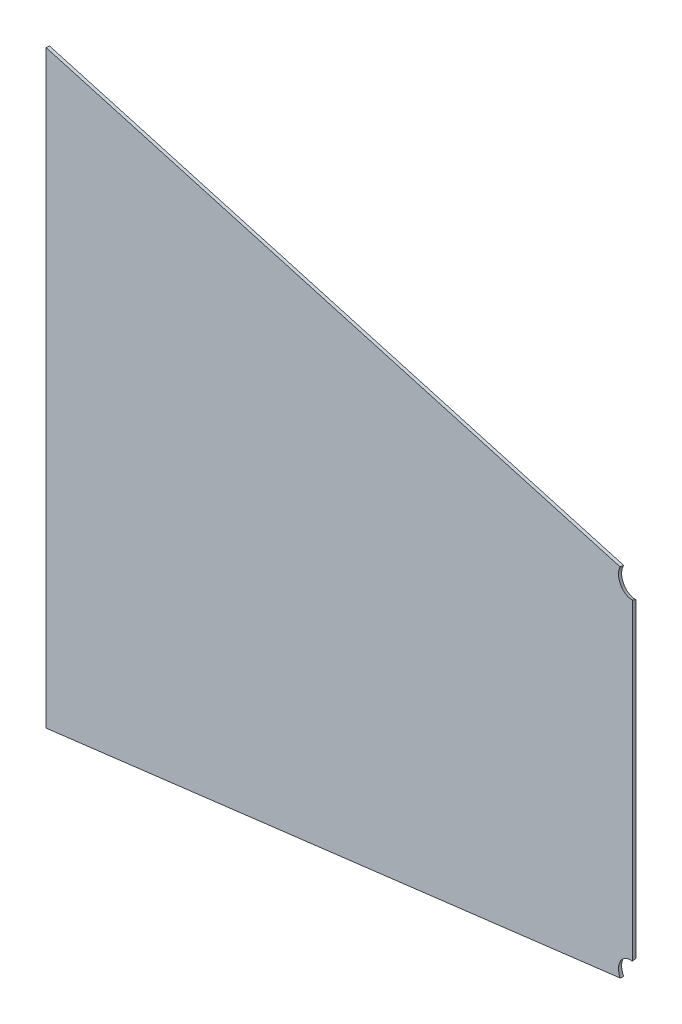
ISO-10303-21;
HEADER;
FILE_DESCRIPTION(('STEP AP214'),'2;1');
FILE_NAME('part.step','',(''),(''),'','','');
FILE_SCHEMA(('AUTOMOTIVE_DESIGN { 1 0 10303 214 1 1 1 1 }'));
ENDSEC;
DATA;
#1=APPLICATION_CONTEXT('core data for automotive mechanical design processes');
#2=APPLICATION_PROTOCOL_DEFINITION('international standard','automotive_design',2000,#1);
#3=PRODUCT_CONTEXT('',#1,'mechanical');
#4=PRODUCT('Part','Part','',(#3));
#5=PRODUCT_RELATED_PRODUCT_CATEGORY('part','',(#4));
#6=PRODUCT_DEFINITION_FORMATION('','',#4);
#7=PRODUCT_DEFINITION_CONTEXT('part definition',#1,'design');
#8=PRODUCT_DEFINITION('design','',#6,#7);
#9=PRODUCT_DEFINITION_SHAPE('','',#8);
#10=(LENGTH_UNIT() NAMED_UNIT(*) SI_UNIT(.MILLI.,.METRE.));
#11=(NAMED_UNIT(*) PLANE_ANGLE_UNIT() SI_UNIT($,.RADIAN.));
#12=(NAMED_UNIT(*) SI_UNIT($,.STERADIAN.) SOLID_ANGLE_UNIT());
#13=UNCERTAINTY_MEASURE_WITH_UNIT(LENGTH_MEASURE(1.E-05),#10,'distance_accuracy_value','');
#14=(GEOMETRIC_REPRESENTATION_CONTEXT(3) GLOBAL_UNCERTAINTY_ASSIGNED_CONTEXT((#13)) GLOBAL_UNIT_ASSIGNED_CONTEXT((#10,
#11,#12)) REPRESENTATION_CONTEXT('',''));
#15=CARTESIAN_POINT('',(0.,0.,0.));
#16=DIRECTION('',(0.,0.,1.));
#17=DIRECTION('',(1.,0.,0.));
#18=AXIS2_PLACEMENT_3D('',#15,#16,#17);
#19=CARTESIAN_POINT('',(185.325599863576,-298.45,-15.8314114961604));
#20=DIRECTION('',(-0.183879380206342,0.982853972184214,-0.0136544094212631));
#21=DIRECTION('',(-0.982945608068834,-0.183896524105788,0.));
#22=AXIS2_PLACEMENT_3D('',#19,#20,#21);
#23=PLANE('',#22);
#24=CARTESIAN_POINT('',(825.5,-177.8,47.6250000000003));
#25=DIRECTION('',(-0.183879380206342,0.982853972184214,-0.0136544094212631));
#26=DIRECTION('',(-0.0641324979789552,0.00186562054135586,0.997939648557454));
#27=AXIS2_PLACEMENT_3D('',#24,#25,#26);
#28=ELLIPSE('',#27,43.3849012466059,14.2875);
#29=CARTESIAN_POINT('',(812.937098512754,-180.340240061228,33.9571444631133));
#30=VERTEX_POINT('',#29);
#31=CARTESIAN_POINT('',(813.501935973131,-180.278213999193,30.8153461357374));
#32=VERTEX_POINT('',#31);
#33=EDGE_CURVE('E91',#30,#32,#28,.F.);
#34=ORIENTED_EDGE('',*,*,#33,.F.);
#35=DIRECTION('',(-0.980155318065139,-0.184385653893442,-0.0727838107474114));
#36=VECTOR('',#35,1.);
#37=CARTESIAN_POINT('',(185.090479890861,-298.45,-12.6651291969283));
#38=LINE('',#37,#36);
#39=CARTESIAN_POINT('',(185.090479890861,-298.45,-12.6651291969283));
#40=VERTEX_POINT('',#39);
#41=EDGE_CURVE('E100',#30,#40,#38,.T.);
#42=ORIENTED_EDGE('',*,*,#41,.T.);
#43=DIRECTION('',(-0.0740535347134658,0.,0.99725426747467));
#44=VECTOR('',#43,1.);
#45=CARTESIAN_POINT('',(185.325599863576,-298.45,-15.8314114961604));
#46=LINE('',#45,#44);
#47=CARTESIAN_POINT('',(185.325599863576,-298.45,-15.8314114961604));
#48=VERTEX_POINT('',#47);
#49=EDGE_CURVE('E126',#48,#40,#46,.T.);
#50=ORIENTED_EDGE('',*,*,#49,.F.);
#51=DIRECTION('',(-0.980155318065139,-0.184385653893442,-0.0727838107474114));
#52=VECTOR('',#51,1.);
#53=CARTESIAN_POINT('',(185.325599863576,-298.45,-15.8314114961604));
#54=LINE('',#53,#52);
#55=EDGE_CURVE('E102',#32,#48,#54,.T.);
#56=ORIENTED_EDGE('',*,*,#55,.F.);
#57=EDGE_LOOP('',(#34,#42,#50,#56));
#58=FACE_BOUND('',#57,.T.);
#59=ADVANCED_FACE('F41',(#58),#23,.F.);
#60=CARTESIAN_POINT('',(185.325599863576,-298.45,-15.8314114961604));
#61=DIRECTION('',(0.99725426747467,0.,0.0740535347134658));
#62=DIRECTION('',(0.0740535347134658,0.,-0.99725426747467));
#63=AXIS2_PLACEMENT_3D('',#60,#61,#62);
#64=PLANE('',#63);
#65=DIRECTION('',(0.,1.,0.));
#66=VECTOR('',#65,1.);
#67=CARTESIAN_POINT('',(185.090479890861,-298.45,-12.6651291969283));
#68=LINE('',#67,#66);
#69=CARTESIAN_POINT('',(185.090479890861,298.45,-12.6651291969283));
#70=VERTEX_POINT('',#69);
#71=EDGE_CURVE('E107',#40,#70,#68,.T.);
#72=ORIENTED_EDGE('',*,*,#71,.T.);
#73=DIRECTION('',(-0.0740535347134658,0.,0.99725426747467));
#74=VECTOR('',#73,1.);
#75=CARTESIAN_POINT('',(185.325599863576,298.45,-15.8314114961604));
#76=LINE('',#75,#74);
#77=CARTESIAN_POINT('',(185.325599863576,298.45,-15.8314114961604));
#78=VERTEX_POINT('',#77);
#79=EDGE_CURVE('E123',#78,#70,#76,.T.);
#80=ORIENTED_EDGE('',*,*,#79,.F.);
#81=DIRECTION('',(0.,1.,0.));
#82=VECTOR('',#81,1.);
#83=CARTESIAN_POINT('',(185.325599863576,-298.45,-15.8314114961604));
#84=LINE('',#83,#82);
#85=EDGE_CURVE('E139',#48,#78,#84,.T.);
#86=ORIENTED_EDGE('',*,*,#85,.F.);
#87=ORIENTED_EDGE('',*,*,#49,.T.);
#88=EDGE_LOOP('',(#72,#80,#86,#87));
#89=FACE_BOUND('',#88,.T.);
#90=ADVANCED_FACE('F150',(#89),#64,.F.);
#91=CARTESIAN_POINT('',(826.675599863577,177.8,31.7935885038397));
#92=DIRECTION('',(-0.183879380206342,-0.982853972184214,-0.0136544094212631));
#93=DIRECTION('',(0.982945608068834,-0.183896524105788,0.));
#94=AXIS2_PLACEMENT_3D('',#91,#92,#93);
#95=PLANE('',#94);
#96=DIRECTION('',(0.980155318065139,-0.184385653893442,0.0727838107474114));
#97=VECTOR('',#96,1.);
#98=CARTESIAN_POINT('',(826.440479890861,177.8,34.9598708030718));
#99=LINE('',#98,#97);
#100=CARTESIAN_POINT('',(812.937098512754,180.340240061228,33.9571444631133));
#101=VERTEX_POINT('',#100);
#102=EDGE_CURVE('E111',#70,#101,#99,.T.);
#103=ORIENTED_EDGE('',*,*,#102,.T.);
#104=CARTESIAN_POINT('',(825.5,177.8,47.6250000000001));
#105=DIRECTION('',(-0.183879380206342,-0.982853972184214,-0.0136544094212631));
#106=DIRECTION('',(-0.0641324979789552,-0.00186562054135586,0.997939648557454));
#107=AXIS2_PLACEMENT_3D('',#104,#105,#106);
#108=ELLIPSE('',#107,43.3849012466059,14.2875);
#109=CARTESIAN_POINT('',(813.501935973131,180.278213999193,30.8153461357373));
#110=VERTEX_POINT('',#109);
#111=EDGE_CURVE('E62',#101,#110,#108,.T.);
#112=ORIENTED_EDGE('',*,*,#111,.T.);
#113=DIRECTION('',(0.980155318065139,-0.184385653893442,0.0727838107474114));
#114=VECTOR('',#113,1.);
#115=CARTESIAN_POINT('',(826.675599863577,177.8,31.7935885038397));
#116=LINE('',#115,#114);
#117=EDGE_CURVE('E140',#78,#110,#116,.T.);
#118=ORIENTED_EDGE('',*,*,#117,.F.);
#119=ORIENTED_EDGE('',*,*,#79,.T.);
#120=EDGE_LOOP('',(#103,#112,#118,#119));
#121=FACE_BOUND('',#120,.T.);
#122=ADVANCED_FACE('F146',(#121),#95,.F.);
#123=CARTESIAN_POINT('',(826.675599863577,-177.8,31.7935885038397));
#124=DIRECTION('',(-0.99725426747467,0.,-0.0740535347134658));
#125=DIRECTION('',(-0.0740535347134658,0.,0.99725426747467));
#126=AXIS2_PLACEMENT_3D('',#123,#124,#125);
#127=PLANE('',#126);
#128=CARTESIAN_POINT('',(825.5,-177.800000000001,47.6250000000034));
#129=DIRECTION('',(-0.99725426747467,0.,-0.0740535347134658));
#130=DIRECTION('',(-0.0700916231389607,-0.322705691594541,0.943900524938002));
#131=AXIS2_PLACEMENT_3D('',#128,#129,#130);
#132=ELLIPSE('',#131,203.782121898034,14.2875);
#133=CARTESIAN_POINT('',(826.675599863577,-157.377540141395,31.7935885038397));
#134=VERTEX_POINT('',#133);
#135=CARTESIAN_POINT('',(826.440479890861,-158.435667405007,34.9598708030718));
#136=VERTEX_POINT('',#135);
#137=EDGE_CURVE('E55',#134,#136,#132,.F.);
#138=ORIENTED_EDGE('',*,*,#137,.F.);
#139=DIRECTION('',(0.,-1.,0.));
#140=VECTOR('',#139,1.);
#141=CARTESIAN_POINT('',(826.675599863577,-177.8,31.7935885038397));
#142=LINE('',#141,#140);
#143=CARTESIAN_POINT('',(826.675599863577,157.377540141395,31.7935885038397));
#144=VERTEX_POINT('',#143);
#145=EDGE_CURVE('E116',#144,#134,#142,.T.);
#146=ORIENTED_EDGE('',*,*,#145,.F.);
#147=CARTESIAN_POINT('',(825.5,177.800000000001,47.6250000000034));
#148=DIRECTION('',(-0.99725426747467,0.,-0.0740535347134658));
#149=DIRECTION('',(-0.0700916231389607,0.322705691594541,0.943900524938002));
#150=AXIS2_PLACEMENT_3D('',#147,#148,#149);
#151=ELLIPSE('',#150,203.782121898034,14.2875);
#152=CARTESIAN_POINT('',(826.440479890861,158.435667405008,34.9598708030718));
#153=VERTEX_POINT('',#152);
#154=EDGE_CURVE('E129',#144,#153,#151,.T.);
#155=ORIENTED_EDGE('',*,*,#154,.T.);
#156=DIRECTION('',(0.,-1.,0.));
#157=VECTOR('',#156,1.);
#158=CARTESIAN_POINT('',(826.440479890861,-177.8,34.9598708030718));
#159=LINE('',#158,#157);
#160=EDGE_CURVE('E121',#153,#136,#159,.T.);
#161=ORIENTED_EDGE('',*,*,#160,.T.);
#162=EDGE_LOOP('',(#138,#146,#155,#161));
#163=FACE_BOUND('',#162,.T.);
#164=ADVANCED_FACE('F132',(#163),#127,.F.);
#165=CARTESIAN_POINT('',(2.18546483713156,0.,-29.4309264733717));
#166=DIRECTION('',(-0.0740535347134658,0.,0.99725426747467));
#167=DIRECTION('',(0.997254267474671,0.,0.0740535347134658));
#168=AXIS2_PLACEMENT_3D('',#165,#166,#167);
#169=PLANE('',#168);
#170=CARTESIAN_POINT('',(825.5,-172.387473509328,31.7062914842672));
#171=DIRECTION('',(-0.0740535347134658,0.,0.99725426747467));
#172=DIRECTION('',(0.212224619630727,-0.977093832105223,0.0157592539329748));
#173=AXIS2_PLACEMENT_3D('',#170,#171,#172);
#174=ELLIPSE('',#173,15.1323357845075,14.2875);
#175=EDGE_CURVE('E103',#32,#134,#174,.F.);
#176=ORIENTED_EDGE('',*,*,#175,.F.);
#177=ORIENTED_EDGE('',*,*,#55,.T.);
#178=ORIENTED_EDGE('',*,*,#85,.T.);
#179=ORIENTED_EDGE('',*,*,#117,.T.);
#180=CARTESIAN_POINT('',(825.5,172.387473509328,31.7062914842672));
#181=DIRECTION('',(-0.0740535347134658,0.,0.99725426747467));
#182=DIRECTION('',(0.212224619630727,0.977093832105223,0.0157592539329748));
#183=AXIS2_PLACEMENT_3D('',#180,#181,#182);
#184=ELLIPSE('',#183,15.1323357845075,14.2875);
#185=EDGE_CURVE('E109',#110,#144,#184,.T.);
#186=ORIENTED_EDGE('',*,*,#185,.T.);
#187=ORIENTED_EDGE('',*,*,#145,.T.);
#188=EDGE_LOOP('',(#176,#177,#178,#179,#186,#187));
#189=FACE_BOUND('',#188,.T.);
#190=ADVANCED_FACE('F144',(#189),#169,.F.);
#191=CARTESIAN_POINT('',(1.95034486441631,0.,-26.2646441741396));
#192=DIRECTION('',(-0.0740535347134658,0.,0.99725426747467));
#193=DIRECTION('',(0.997254267474671,0.,0.0740535347134658));
#194=AXIS2_PLACEMENT_3D('',#191,#192,#193);
#195=PLANE('',#194);
#196=ORIENTED_EDGE('',*,*,#41,.F.);
#197=CARTESIAN_POINT('',(825.5,-173.469978807462,34.8900331874138));
#198=DIRECTION('',(-0.0740535347134658,0.,0.99725426747467));
#199=DIRECTION('',(0.212224619630727,-0.977093832105223,0.0157592539329748));
#200=AXIS2_PLACEMENT_3D('',#197,#198,#199);
#201=ELLIPSE('',#200,15.1323357845075,14.2875);
#202=EDGE_CURVE('E11',#30,#136,#201,.F.);
#203=ORIENTED_EDGE('',*,*,#202,.T.);
#204=ORIENTED_EDGE('',*,*,#160,.F.);
#205=CARTESIAN_POINT('',(825.5,173.469978807462,34.8900331874138));
#206=DIRECTION('',(-0.0740535347134658,0.,0.99725426747467));
#207=DIRECTION('',(0.212224619630727,0.977093832105223,0.0157592539329748));
#208=AXIS2_PLACEMENT_3D('',#205,#206,#207);
#209=ELLIPSE('',#208,15.1323357845075,14.2875);
#210=EDGE_CURVE('E48',#101,#153,#209,.T.);
#211=ORIENTED_EDGE('',*,*,#210,.F.);
#212=ORIENTED_EDGE('',*,*,#102,.F.);
#213=ORIENTED_EDGE('',*,*,#71,.F.);
#214=EDGE_LOOP('',(#196,#203,#204,#211,#212,#213));
#215=FACE_BOUND('',#214,.T.);
#216=ADVANCED_FACE('F105',(#215),#195,.T.);
#217=CARTESIAN_POINT('',(825.5,109.107616512264,-154.405240752952));
#218=DIRECTION('',(0.,0.32191156150474,0.946769743163342));
#219=DIRECTION('',(0.,-0.946769743163342,0.32191156150474));
#220=AXIS2_PLACEMENT_3D('',#217,#218,#219);
#221=CYLINDRICAL_SURFACE('',#220,14.2875);
#222=ORIENTED_EDGE('',*,*,#111,.F.);
#223=ORIENTED_EDGE('',*,*,#210,.T.);
#224=ORIENTED_EDGE('',*,*,#154,.F.);
#225=ORIENTED_EDGE('',*,*,#185,.F.);
#226=EDGE_LOOP('',(#222,#223,#224,#225));
#227=FACE_BOUND('',#226,.T.);
#228=ADVANCED_FACE('F128',(#227),#221,.F.);
#229=CARTESIAN_POINT('',(825.5,-109.107616512264,-154.405240752952));
#230=DIRECTION('',(0.,-0.32191156150474,0.946769743163342));
#231=DIRECTION('',(0.,-0.946769743163342,-0.32191156150474));
#232=AXIS2_PLACEMENT_3D('',#229,#230,#231);
#233=CYLINDRICAL_SURFACE('',#232,14.2875);
#234=ORIENTED_EDGE('',*,*,#175,.T.);
#235=ORIENTED_EDGE('',*,*,#137,.T.);
#236=ORIENTED_EDGE('',*,*,#202,.F.);
#237=ORIENTED_EDGE('',*,*,#33,.T.);
#238=EDGE_LOOP('',(#234,#235,#236,#237));
#239=FACE_BOUND('',#238,.T.);
#240=ADVANCED_FACE('F90',(#239),#233,.F.);
#241=CLOSED_SHELL('',(#59,#90,#122,#164,#190,#216,#228,#240));
#242=MANIFOLD_SOLID_BREP('B2',#241);
#243=ADVANCED_BREP_SHAPE_REPRESENTATION('',(#18,#242),#14);
#244=SHAPE_DEFINITION_REPRESENTATION(#9,#243);
ENDSEC;
END-ISO-10303-21;
